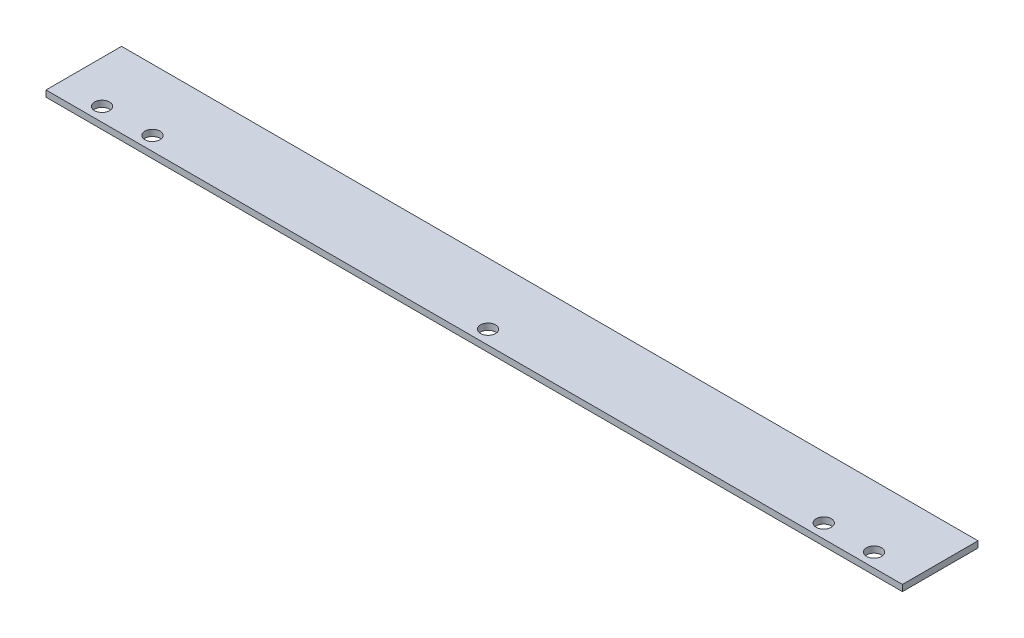
ISO-10303-21;
HEADER;
FILE_DESCRIPTION(('STEP AP214'),'2;1');
FILE_NAME('part.step','',(''),(''),'','','');
FILE_SCHEMA(('AUTOMOTIVE_DESIGN { 1 0 10303 214 1 1 1 1 }'));
ENDSEC;
DATA;
#1=APPLICATION_CONTEXT('core data for automotive mechanical design processes');
#2=APPLICATION_PROTOCOL_DEFINITION('international standard','automotive_design',2000,#1);
#3=PRODUCT_CONTEXT('',#1,'mechanical');
#4=PRODUCT('Part','Part','',(#3));
#5=PRODUCT_RELATED_PRODUCT_CATEGORY('part','',(#4));
#6=PRODUCT_DEFINITION_FORMATION('','',#4);
#7=PRODUCT_DEFINITION_CONTEXT('part definition',#1,'design');
#8=PRODUCT_DEFINITION('design','',#6,#7);
#9=PRODUCT_DEFINITION_SHAPE('','',#8);
#10=(LENGTH_UNIT() NAMED_UNIT(*) SI_UNIT(.MILLI.,.METRE.));
#11=(NAMED_UNIT(*) PLANE_ANGLE_UNIT() SI_UNIT($,.RADIAN.));
#12=(NAMED_UNIT(*) SI_UNIT($,.STERADIAN.) SOLID_ANGLE_UNIT());
#13=UNCERTAINTY_MEASURE_WITH_UNIT(LENGTH_MEASURE(1.E-05),#10,'distance_accuracy_value','');
#14=(GEOMETRIC_REPRESENTATION_CONTEXT(3) GLOBAL_UNCERTAINTY_ASSIGNED_CONTEXT((#13)) GLOBAL_UNIT_ASSIGNED_CONTEXT((#10,
#11,#12)) REPRESENTATION_CONTEXT('',''));
#15=CARTESIAN_POINT('',(0.,0.,0.));
#16=DIRECTION('',(0.,0.,1.));
#17=DIRECTION('',(1.,0.,0.));
#18=AXIS2_PLACEMENT_3D('',#15,#16,#17);
#19=CARTESIAN_POINT('',(0.,1.5875,0.));
#20=DIRECTION('',(0.,-1.,0.));
#21=DIRECTION('',(0.,0.,-1.));
#22=AXIS2_PLACEMENT_3D('',#19,#20,#21);
#23=PLANE('',#22);
#24=CARTESIAN_POINT('',(-97.3122366595265,1.5875,6.03492833681039));
#25=DIRECTION('',(0.,1.,0.));
#26=DIRECTION('',(0.,0.,1.));
#27=AXIS2_PLACEMENT_3D('',#24,#25,#26);
#28=CIRCLE('',#27,1.89865);
#29=CARTESIAN_POINT('',(-97.3122366595265,1.5875,7.9335783368104));
#30=VERTEX_POINT('',#29);
#31=EDGE_CURVE('E137',#30,#30,#28,.T.);
#32=ORIENTED_EDGE('',*,*,#31,.F.);
#33=EDGE_LOOP('',(#32));
#34=FACE_BOUND('',#33,.T.);
#35=CARTESIAN_POINT('',(0.,1.5875,6.03492833681039));
#36=DIRECTION('',(0.,1.,0.));
#37=DIRECTION('',(0.,0.,1.));
#38=AXIS2_PLACEMENT_3D('',#35,#36,#37);
#39=CIRCLE('',#38,1.89865);
#40=CARTESIAN_POINT('',(0.,1.5875,7.93357833681039));
#41=VERTEX_POINT('',#40);
#42=EDGE_CURVE('E131',#41,#41,#39,.T.);
#43=ORIENTED_EDGE('',*,*,#42,.F.);
#44=EDGE_LOOP('',(#43));
#45=FACE_BOUND('',#44,.T.);
#46=CARTESIAN_POINT('',(-84.6122366595265,1.5875,6.03492833681041));
#47=DIRECTION('',(0.,1.,0.));
#48=DIRECTION('',(0.,0.,1.));
#49=AXIS2_PLACEMENT_3D('',#46,#47,#48);
#50=CIRCLE('',#49,1.89865);
#51=CARTESIAN_POINT('',(-84.6122366595265,1.5875,7.93357833681041));
#52=VERTEX_POINT('',#51);
#53=EDGE_CURVE('E119',#52,#52,#50,.T.);
#54=ORIENTED_EDGE('',*,*,#53,.F.);
#55=EDGE_LOOP('',(#54));
#56=FACE_BOUND('',#55,.T.);
#57=CARTESIAN_POINT('',(84.6122366595264,1.5875,6.03492833681041));
#58=DIRECTION('',(0.,1.,0.));
#59=DIRECTION('',(0.,0.,1.));
#60=AXIS2_PLACEMENT_3D('',#57,#58,#59);
#61=CIRCLE('',#60,1.89865);
#62=CARTESIAN_POINT('',(84.6122366595264,1.5875,7.93357833681041));
#63=VERTEX_POINT('',#62);
#64=EDGE_CURVE('E113',#63,#63,#61,.T.);
#65=ORIENTED_EDGE('',*,*,#64,.F.);
#66=EDGE_LOOP('',(#65));
#67=FACE_BOUND('',#66,.T.);
#68=DIRECTION('',(0.,0.,-1.));
#69=VECTOR('',#68,1.);
#70=CARTESIAN_POINT('',(107.95,1.5875,9.525));
#71=LINE('',#70,#69);
#72=CARTESIAN_POINT('',(107.95,1.5875,9.525));
#73=VERTEX_POINT('',#72);
#74=CARTESIAN_POINT('',(107.95,1.5875,-9.525));
#75=VERTEX_POINT('',#74);
#76=EDGE_CURVE('E85',#73,#75,#71,.T.);
#77=ORIENTED_EDGE('',*,*,#76,.T.);
#78=DIRECTION('',(-1.,0.,0.));
#79=VECTOR('',#78,1.);
#80=CARTESIAN_POINT('',(-107.95,1.5875,-9.525));
#81=LINE('',#80,#79);
#82=CARTESIAN_POINT('',(-107.95,1.5875,-9.525));
#83=VERTEX_POINT('',#82);
#84=EDGE_CURVE('E80',#75,#83,#81,.T.);
#85=ORIENTED_EDGE('',*,*,#84,.T.);
#86=DIRECTION('',(0.,0.,1.));
#87=VECTOR('',#86,1.);
#88=CARTESIAN_POINT('',(-107.95,1.5875,9.525));
#89=LINE('',#88,#87);
#90=CARTESIAN_POINT('',(-107.95,1.5875,9.525));
#91=VERTEX_POINT('',#90);
#92=EDGE_CURVE('E83',#83,#91,#89,.T.);
#93=ORIENTED_EDGE('',*,*,#92,.T.);
#94=DIRECTION('',(1.,0.,0.));
#95=VECTOR('',#94,1.);
#96=CARTESIAN_POINT('',(-107.95,1.5875,9.525));
#97=LINE('',#96,#95);
#98=EDGE_CURVE('E50',#91,#73,#97,.T.);
#99=ORIENTED_EDGE('',*,*,#98,.T.);
#100=EDGE_LOOP('',(#77,#85,#93,#99));
#101=FACE_BOUND('',#100,.T.);
#102=CARTESIAN_POINT('',(97.3122366595264,1.5875,6.03492833681037));
#103=DIRECTION('',(0.,1.,0.));
#104=DIRECTION('',(0.,0.,1.));
#105=AXIS2_PLACEMENT_3D('',#102,#103,#104);
#106=CIRCLE('',#105,1.89865);
#107=CARTESIAN_POINT('',(97.3122366595264,1.5875,7.93357833681037));
#108=VERTEX_POINT('',#107);
#109=EDGE_CURVE('E125',#108,#108,#106,.T.);
#110=ORIENTED_EDGE('',*,*,#109,.F.);
#111=EDGE_LOOP('',(#110));
#112=FACE_BOUND('',#111,.T.);
#113=ADVANCED_FACE('F33',(#34,#45,#56,#67,#101,#112),#23,.F.);
#114=CARTESIAN_POINT('',(107.95,1.5875,9.525));
#115=DIRECTION('',(-1.,0.,0.));
#116=DIRECTION('',(0.,0.,1.));
#117=AXIS2_PLACEMENT_3D('',#114,#115,#116);
#118=PLANE('',#117);
#119=DIRECTION('',(0.,0.,-1.));
#120=VECTOR('',#119,1.);
#121=CARTESIAN_POINT('',(107.95,0.,9.525));
#122=LINE('',#121,#120);
#123=CARTESIAN_POINT('',(107.95,0.,9.525));
#124=VERTEX_POINT('',#123);
#125=CARTESIAN_POINT('',(107.95,0.,-9.525));
#126=VERTEX_POINT('',#125);
#127=EDGE_CURVE('E97',#124,#126,#122,.T.);
#128=ORIENTED_EDGE('',*,*,#127,.T.);
#129=DIRECTION('',(0.,-1.,0.));
#130=VECTOR('',#129,1.);
#131=CARTESIAN_POINT('',(107.95,1.5875,-9.525));
#132=LINE('',#131,#130);
#133=EDGE_CURVE('E11',#75,#126,#132,.T.);
#134=ORIENTED_EDGE('',*,*,#133,.F.);
#135=ORIENTED_EDGE('',*,*,#76,.F.);
#136=DIRECTION('',(0.,-1.,0.));
#137=VECTOR('',#136,1.);
#138=CARTESIAN_POINT('',(107.95,1.5875,9.525));
#139=LINE('',#138,#137);
#140=EDGE_CURVE('E93',#73,#124,#139,.T.);
#141=ORIENTED_EDGE('',*,*,#140,.T.);
#142=EDGE_LOOP('',(#128,#134,#135,#141));
#143=FACE_BOUND('',#142,.T.);
#144=ADVANCED_FACE('F35',(#143),#118,.F.);
#145=CARTESIAN_POINT('',(-107.95,1.5875,-9.525));
#146=DIRECTION('',(0.,0.,1.));
#147=DIRECTION('',(1.,0.,0.));
#148=AXIS2_PLACEMENT_3D('',#145,#146,#147);
#149=PLANE('',#148);
#150=DIRECTION('',(-1.,0.,0.));
#151=VECTOR('',#150,1.);
#152=CARTESIAN_POINT('',(-107.95,0.,-9.525));
#153=LINE('',#152,#151);
#154=CARTESIAN_POINT('',(-107.95,0.,-9.525));
#155=VERTEX_POINT('',#154);
#156=EDGE_CURVE('E89',#126,#155,#153,.T.);
#157=ORIENTED_EDGE('',*,*,#156,.T.);
#158=DIRECTION('',(0.,-1.,0.));
#159=VECTOR('',#158,1.);
#160=CARTESIAN_POINT('',(-107.95,1.5875,-9.525));
#161=LINE('',#160,#159);
#162=EDGE_CURVE('E42',#83,#155,#161,.T.);
#163=ORIENTED_EDGE('',*,*,#162,.F.);
#164=ORIENTED_EDGE('',*,*,#84,.F.);
#165=ORIENTED_EDGE('',*,*,#133,.T.);
#166=EDGE_LOOP('',(#157,#163,#164,#165));
#167=FACE_BOUND('',#166,.T.);
#168=ADVANCED_FACE('F88',(#167),#149,.F.);
#169=CARTESIAN_POINT('',(-107.95,1.5875,9.525));
#170=DIRECTION('',(1.,0.,0.));
#171=DIRECTION('',(0.,0.,-1.));
#172=AXIS2_PLACEMENT_3D('',#169,#170,#171);
#173=PLANE('',#172);
#174=DIRECTION('',(0.,0.,1.));
#175=VECTOR('',#174,1.);
#176=CARTESIAN_POINT('',(-107.95,0.,9.525));
#177=LINE('',#176,#175);
#178=CARTESIAN_POINT('',(-107.95,0.,9.525));
#179=VERTEX_POINT('',#178);
#180=EDGE_CURVE('E67',#155,#179,#177,.T.);
#181=ORIENTED_EDGE('',*,*,#180,.T.);
#182=DIRECTION('',(0.,-1.,0.));
#183=VECTOR('',#182,1.);
#184=CARTESIAN_POINT('',(-107.95,1.5875,9.525));
#185=LINE('',#184,#183);
#186=EDGE_CURVE('E90',#91,#179,#185,.T.);
#187=ORIENTED_EDGE('',*,*,#186,.F.);
#188=ORIENTED_EDGE('',*,*,#92,.F.);
#189=ORIENTED_EDGE('',*,*,#162,.T.);
#190=EDGE_LOOP('',(#181,#187,#188,#189));
#191=FACE_BOUND('',#190,.T.);
#192=ADVANCED_FACE('F91',(#191),#173,.F.);
#193=CARTESIAN_POINT('',(-107.95,1.5875,9.525));
#194=DIRECTION('',(0.,0.,-1.));
#195=DIRECTION('',(-1.,0.,0.));
#196=AXIS2_PLACEMENT_3D('',#193,#194,#195);
#197=PLANE('',#196);
#198=DIRECTION('',(1.,0.,0.));
#199=VECTOR('',#198,1.);
#200=CARTESIAN_POINT('',(-107.95,0.,9.525));
#201=LINE('',#200,#199);
#202=EDGE_CURVE('E73',#179,#124,#201,.T.);
#203=ORIENTED_EDGE('',*,*,#202,.T.);
#204=ORIENTED_EDGE('',*,*,#140,.F.);
#205=ORIENTED_EDGE('',*,*,#98,.F.);
#206=ORIENTED_EDGE('',*,*,#186,.T.);
#207=EDGE_LOOP('',(#203,#204,#205,#206));
#208=FACE_BOUND('',#207,.T.);
#209=ADVANCED_FACE('F105',(#208),#197,.F.);
#210=CARTESIAN_POINT('',(0.,0.,0.));
#211=DIRECTION('',(0.,-1.,0.));
#212=DIRECTION('',(0.,0.,-1.));
#213=AXIS2_PLACEMENT_3D('',#210,#211,#212);
#214=PLANE('',#213);
#215=CARTESIAN_POINT('',(-97.3122366595265,0.,6.03492833681039));
#216=DIRECTION('',(0.,-1.,0.));
#217=DIRECTION('',(0.,0.,-1.));
#218=AXIS2_PLACEMENT_3D('',#215,#216,#217);
#219=CIRCLE('',#218,1.89865);
#220=CARTESIAN_POINT('',(-97.3122366595265,0.,4.13627833681039));
#221=VERTEX_POINT('',#220);
#222=EDGE_CURVE('E134',#221,#221,#219,.T.);
#223=ORIENTED_EDGE('',*,*,#222,.F.);
#224=EDGE_LOOP('',(#223));
#225=FACE_BOUND('',#224,.T.);
#226=CARTESIAN_POINT('',(0.,0.,6.03492833681039));
#227=DIRECTION('',(0.,-1.,0.));
#228=DIRECTION('',(0.,0.,-1.));
#229=AXIS2_PLACEMENT_3D('',#226,#227,#228);
#230=CIRCLE('',#229,1.89865);
#231=CARTESIAN_POINT('',(0.,0.,4.13627833681039));
#232=VERTEX_POINT('',#231);
#233=EDGE_CURVE('E128',#232,#232,#230,.T.);
#234=ORIENTED_EDGE('',*,*,#233,.F.);
#235=EDGE_LOOP('',(#234));
#236=FACE_BOUND('',#235,.T.);
#237=CARTESIAN_POINT('',(97.3122366595264,0.,6.03492833681037));
#238=DIRECTION('',(0.,-1.,0.));
#239=DIRECTION('',(0.,0.,-1.));
#240=AXIS2_PLACEMENT_3D('',#237,#238,#239);
#241=CIRCLE('',#240,1.89865);
#242=CARTESIAN_POINT('',(97.3122366595264,0.,4.13627833681037));
#243=VERTEX_POINT('',#242);
#244=EDGE_CURVE('E122',#243,#243,#241,.T.);
#245=ORIENTED_EDGE('',*,*,#244,.F.);
#246=EDGE_LOOP('',(#245));
#247=FACE_BOUND('',#246,.T.);
#248=CARTESIAN_POINT('',(-84.6122366595265,0.,6.03492833681041));
#249=DIRECTION('',(0.,-1.,0.));
#250=DIRECTION('',(0.,0.,-1.));
#251=AXIS2_PLACEMENT_3D('',#248,#249,#250);
#252=CIRCLE('',#251,1.89865);
#253=CARTESIAN_POINT('',(-84.6122366595265,0.,4.13627833681041));
#254=VERTEX_POINT('',#253);
#255=EDGE_CURVE('E116',#254,#254,#252,.T.);
#256=ORIENTED_EDGE('',*,*,#255,.F.);
#257=EDGE_LOOP('',(#256));
#258=FACE_BOUND('',#257,.T.);
#259=CARTESIAN_POINT('',(84.6122366595264,0.,6.03492833681041));
#260=DIRECTION('',(0.,-1.,0.));
#261=DIRECTION('',(0.,0.,-1.));
#262=AXIS2_PLACEMENT_3D('',#259,#260,#261);
#263=CIRCLE('',#262,1.89865);
#264=CARTESIAN_POINT('',(84.6122366595264,0.,4.13627833681041));
#265=VERTEX_POINT('',#264);
#266=EDGE_CURVE('E100',#265,#265,#263,.T.);
#267=ORIENTED_EDGE('',*,*,#266,.F.);
#268=EDGE_LOOP('',(#267));
#269=FACE_BOUND('',#268,.T.);
#270=ORIENTED_EDGE('',*,*,#127,.F.);
#271=ORIENTED_EDGE('',*,*,#202,.F.);
#272=ORIENTED_EDGE('',*,*,#180,.F.);
#273=ORIENTED_EDGE('',*,*,#156,.F.);
#274=EDGE_LOOP('',(#270,#271,#272,#273));
#275=FACE_BOUND('',#274,.T.);
#276=ADVANCED_FACE('F108',(#225,#236,#247,#258,#269,#275),#214,.T.);
#277=CARTESIAN_POINT('',(84.6122366595264,1.5875,6.03492833681041));
#278=DIRECTION('',(0.,1.,0.));
#279=DIRECTION('',(0.,0.,1.));
#280=AXIS2_PLACEMENT_3D('',#277,#278,#279);
#281=CYLINDRICAL_SURFACE('',#280,1.89865);
#282=ORIENTED_EDGE('',*,*,#64,.T.);
#283=EDGE_LOOP('',(#282));
#284=FACE_BOUND('',#283,.T.);
#285=ORIENTED_EDGE('',*,*,#266,.T.);
#286=EDGE_LOOP('',(#285));
#287=FACE_BOUND('',#286,.T.);
#288=ADVANCED_FACE('F153',(#284,#287),#281,.F.);
#289=CARTESIAN_POINT('',(-84.6122366595265,1.5875,6.03492833681041));
#290=DIRECTION('',(0.,1.,0.));
#291=DIRECTION('',(0.,0.,1.));
#292=AXIS2_PLACEMENT_3D('',#289,#290,#291);
#293=CYLINDRICAL_SURFACE('',#292,1.89865);
#294=ORIENTED_EDGE('',*,*,#53,.T.);
#295=EDGE_LOOP('',(#294));
#296=FACE_BOUND('',#295,.T.);
#297=ORIENTED_EDGE('',*,*,#255,.T.);
#298=EDGE_LOOP('',(#297));
#299=FACE_BOUND('',#298,.T.);
#300=ADVANCED_FACE('F156',(#296,#299),#293,.F.);
#301=CARTESIAN_POINT('',(97.3122366595264,1.5875,6.03492833681037));
#302=DIRECTION('',(0.,1.,0.));
#303=DIRECTION('',(0.,0.,1.));
#304=AXIS2_PLACEMENT_3D('',#301,#302,#303);
#305=CYLINDRICAL_SURFACE('',#304,1.89865);
#306=ORIENTED_EDGE('',*,*,#109,.T.);
#307=EDGE_LOOP('',(#306));
#308=FACE_BOUND('',#307,.T.);
#309=ORIENTED_EDGE('',*,*,#244,.T.);
#310=EDGE_LOOP('',(#309));
#311=FACE_BOUND('',#310,.T.);
#312=ADVANCED_FACE('F204',(#308,#311),#305,.F.);
#313=CARTESIAN_POINT('',(0.,1.5875,6.03492833681039));
#314=DIRECTION('',(0.,1.,0.));
#315=DIRECTION('',(0.,0.,1.));
#316=AXIS2_PLACEMENT_3D('',#313,#314,#315);
#317=CYLINDRICAL_SURFACE('',#316,1.89865);
#318=ORIENTED_EDGE('',*,*,#42,.T.);
#319=EDGE_LOOP('',(#318));
#320=FACE_BOUND('',#319,.T.);
#321=ORIENTED_EDGE('',*,*,#233,.T.);
#322=EDGE_LOOP('',(#321));
#323=FACE_BOUND('',#322,.T.);
#324=ADVANCED_FACE('F214',(#320,#323),#317,.F.);
#325=CARTESIAN_POINT('',(-97.3122366595265,1.5875,6.03492833681039));
#326=DIRECTION('',(0.,1.,0.));
#327=DIRECTION('',(0.,0.,1.));
#328=AXIS2_PLACEMENT_3D('',#325,#326,#327);
#329=CYLINDRICAL_SURFACE('',#328,1.89865);
#330=ORIENTED_EDGE('',*,*,#31,.T.);
#331=EDGE_LOOP('',(#330));
#332=FACE_BOUND('',#331,.T.);
#333=ORIENTED_EDGE('',*,*,#222,.T.);
#334=EDGE_LOOP('',(#333));
#335=FACE_BOUND('',#334,.T.);
#336=ADVANCED_FACE('F141',(#332,#335),#329,.F.);
#337=CLOSED_SHELL('',(#113,#144,#168,#192,#209,#276,#288,#300,#312,#324,#336));
#338=MANIFOLD_SOLID_BREP('B2',#337);
#339=ADVANCED_BREP_SHAPE_REPRESENTATION('',(#18,#338),#14);
#340=SHAPE_DEFINITION_REPRESENTATION(#9,#339);
ENDSEC;
END-ISO-10303-21;
